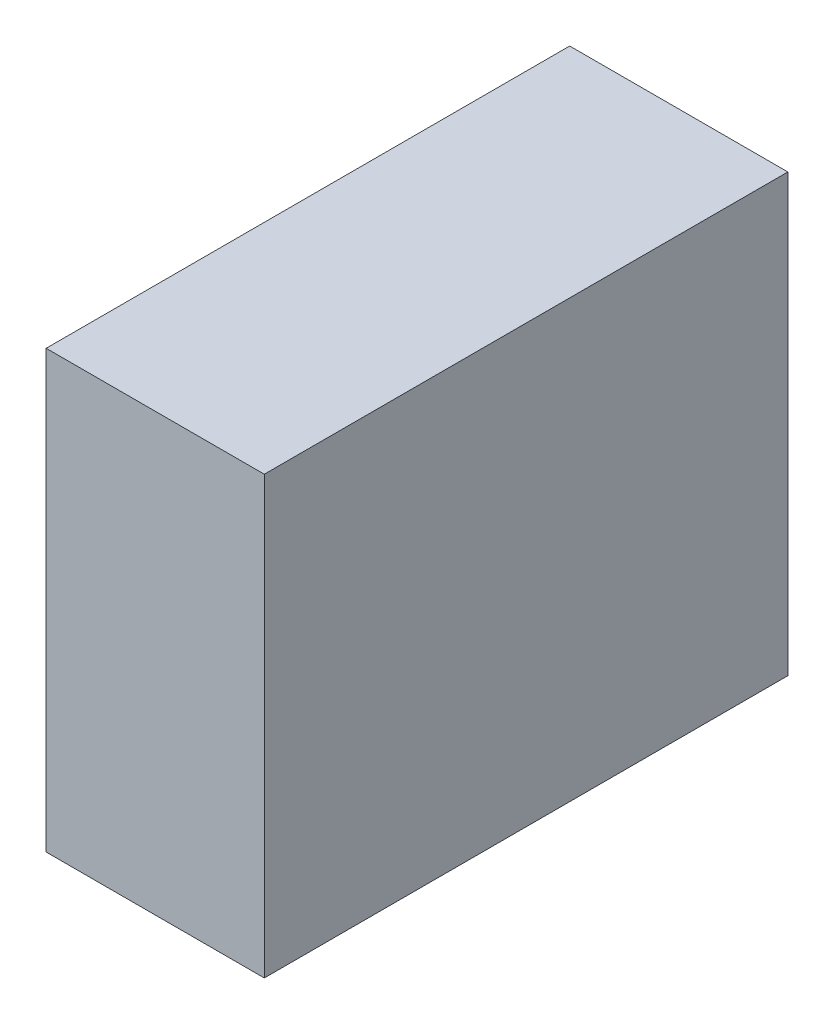
ISO-10303-21;
HEADER;
FILE_DESCRIPTION(('STEP AP214'),'2;1');
FILE_NAME('part.step','',(''),(''),'','','');
FILE_SCHEMA(('AUTOMOTIVE_DESIGN { 1 0 10303 214 1 1 1 1 }'));
ENDSEC;
DATA;
#1=APPLICATION_CONTEXT('core data for automotive mechanical design processes');
#2=APPLICATION_PROTOCOL_DEFINITION('international standard','automotive_design',2000,#1);
#3=PRODUCT_CONTEXT('',#1,'mechanical');
#4=PRODUCT('Part','Part','',(#3));
#5=PRODUCT_RELATED_PRODUCT_CATEGORY('part','',(#4));
#6=PRODUCT_DEFINITION_FORMATION('','',#4);
#7=PRODUCT_DEFINITION_CONTEXT('part definition',#1,'design');
#8=PRODUCT_DEFINITION('design','',#6,#7);
#9=PRODUCT_DEFINITION_SHAPE('','',#8);
#10=(LENGTH_UNIT() NAMED_UNIT(*) SI_UNIT(.MILLI.,.METRE.));
#11=(NAMED_UNIT(*) PLANE_ANGLE_UNIT() SI_UNIT($,.RADIAN.));
#12=(NAMED_UNIT(*) SI_UNIT($,.STERADIAN.) SOLID_ANGLE_UNIT());
#13=UNCERTAINTY_MEASURE_WITH_UNIT(LENGTH_MEASURE(1.E-05),#10,'distance_accuracy_value','');
#14=(GEOMETRIC_REPRESENTATION_CONTEXT(3) GLOBAL_UNCERTAINTY_ASSIGNED_CONTEXT((#13)) GLOBAL_UNIT_ASSIGNED_CONTEXT((#10,
#11,#12)) REPRESENTATION_CONTEXT('',''));
#15=CARTESIAN_POINT('',(0.,0.,0.));
#16=DIRECTION('',(0.,0.,1.));
#17=DIRECTION('',(1.,0.,0.));
#18=AXIS2_PLACEMENT_3D('',#15,#16,#17);
#19=CARTESIAN_POINT('',(370.,200.,-248.));
#20=DIRECTION('',(-1.,0.,0.));
#21=DIRECTION('',(0.,0.,1.));
#22=AXIS2_PLACEMENT_3D('',#19,#20,#21);
#23=PLANE('',#22);
#24=DIRECTION('',(0.,-1.,0.));
#25=VECTOR('',#24,1.);
#26=CARTESIAN_POINT('',(370.,200.,-128.));
#27=LINE('',#26,#25);
#28=CARTESIAN_POINT('',(370.,300.,-128.));
#29=VERTEX_POINT('',#28);
#30=CARTESIAN_POINT('',(370.,200.,-128.));
#31=VERTEX_POINT('',#30);
#32=EDGE_CURVE('E103',#29,#31,#27,.T.);
#33=ORIENTED_EDGE('',*,*,#32,.F.);
#34=DIRECTION('',(0.,0.,1.));
#35=VECTOR('',#34,1.);
#36=CARTESIAN_POINT('',(370.,300.,-248.));
#37=LINE('',#36,#35);
#38=CARTESIAN_POINT('',(370.,300.,-248.));
#39=VERTEX_POINT('',#38);
#40=EDGE_CURVE('E11',#39,#29,#37,.T.);
#41=ORIENTED_EDGE('',*,*,#40,.F.);
#42=DIRECTION('',(0.,-1.,0.));
#43=VECTOR('',#42,1.);
#44=CARTESIAN_POINT('',(370.,200.,-248.));
#45=LINE('',#44,#43);
#46=CARTESIAN_POINT('',(370.,200.,-248.));
#47=VERTEX_POINT('',#46);
#48=EDGE_CURVE('E97',#39,#47,#45,.T.);
#49=ORIENTED_EDGE('',*,*,#48,.T.);
#50=DIRECTION('',(0.,0.,1.));
#51=VECTOR('',#50,1.);
#52=CARTESIAN_POINT('',(370.,200.,-248.));
#53=LINE('',#52,#51);
#54=EDGE_CURVE('E42',#47,#31,#53,.T.);
#55=ORIENTED_EDGE('',*,*,#54,.T.);
#56=EDGE_LOOP('',(#33,#41,#49,#55));
#57=FACE_BOUND('',#56,.T.);
#58=ADVANCED_FACE('F39',(#57),#23,.T.);
#59=CARTESIAN_POINT('',(370.,300.,-248.));
#60=DIRECTION('',(0.,1.,0.));
#61=DIRECTION('',(0.,0.,1.));
#62=AXIS2_PLACEMENT_3D('',#59,#60,#61);
#63=PLANE('',#62);
#64=DIRECTION('',(-1.,0.,0.));
#65=VECTOR('',#64,1.);
#66=CARTESIAN_POINT('',(370.,300.,-128.));
#67=LINE('',#66,#65);
#68=CARTESIAN_POINT('',(420.,300.,-128.));
#69=VERTEX_POINT('',#68);
#70=EDGE_CURVE('E99',#69,#29,#67,.T.);
#71=ORIENTED_EDGE('',*,*,#70,.F.);
#72=DIRECTION('',(0.,0.,1.));
#73=VECTOR('',#72,1.);
#74=CARTESIAN_POINT('',(420.,300.,-248.));
#75=LINE('',#74,#73);
#76=CARTESIAN_POINT('',(420.,300.,-248.));
#77=VERTEX_POINT('',#76);
#78=EDGE_CURVE('E48',#77,#69,#75,.T.);
#79=ORIENTED_EDGE('',*,*,#78,.F.);
#80=DIRECTION('',(-1.,0.,0.));
#81=VECTOR('',#80,1.);
#82=CARTESIAN_POINT('',(370.,300.,-248.));
#83=LINE('',#82,#81);
#84=EDGE_CURVE('E94',#77,#39,#83,.T.);
#85=ORIENTED_EDGE('',*,*,#84,.T.);
#86=ORIENTED_EDGE('',*,*,#40,.T.);
#87=EDGE_LOOP('',(#71,#79,#85,#86));
#88=FACE_BOUND('',#87,.T.);
#89=ADVANCED_FACE('F113',(#88),#63,.T.);
#90=CARTESIAN_POINT('',(420.,200.,-248.));
#91=DIRECTION('',(1.,0.,0.));
#92=DIRECTION('',(0.,0.,-1.));
#93=AXIS2_PLACEMENT_3D('',#90,#91,#92);
#94=PLANE('',#93);
#95=DIRECTION('',(0.,1.,0.));
#96=VECTOR('',#95,1.);
#97=CARTESIAN_POINT('',(420.,200.,-128.));
#98=LINE('',#97,#96);
#99=CARTESIAN_POINT('',(420.,200.,-128.));
#100=VERTEX_POINT('',#99);
#101=EDGE_CURVE('E89',#100,#69,#98,.T.);
#102=ORIENTED_EDGE('',*,*,#101,.F.);
#103=DIRECTION('',(0.,0.,1.));
#104=VECTOR('',#103,1.);
#105=CARTESIAN_POINT('',(420.,200.,-248.));
#106=LINE('',#105,#104);
#107=CARTESIAN_POINT('',(420.,200.,-248.));
#108=VERTEX_POINT('',#107);
#109=EDGE_CURVE('E84',#108,#100,#106,.T.);
#110=ORIENTED_EDGE('',*,*,#109,.F.);
#111=DIRECTION('',(0.,1.,0.));
#112=VECTOR('',#111,1.);
#113=CARTESIAN_POINT('',(420.,200.,-248.));
#114=LINE('',#113,#112);
#115=EDGE_CURVE('E87',#108,#77,#114,.T.);
#116=ORIENTED_EDGE('',*,*,#115,.T.);
#117=ORIENTED_EDGE('',*,*,#78,.T.);
#118=EDGE_LOOP('',(#102,#110,#116,#117));
#119=FACE_BOUND('',#118,.T.);
#120=ADVANCED_FACE('F86',(#119),#94,.T.);
#121=CARTESIAN_POINT('',(370.,200.,-248.));
#122=DIRECTION('',(0.,-1.,0.));
#123=DIRECTION('',(0.,0.,-1.));
#124=AXIS2_PLACEMENT_3D('',#121,#122,#123);
#125=PLANE('',#124);
#126=DIRECTION('',(1.,0.,0.));
#127=VECTOR('',#126,1.);
#128=CARTESIAN_POINT('',(370.,200.,-128.));
#129=LINE('',#128,#127);
#130=EDGE_CURVE('E106',#31,#100,#129,.T.);
#131=ORIENTED_EDGE('',*,*,#130,.F.);
#132=ORIENTED_EDGE('',*,*,#54,.F.);
#133=DIRECTION('',(1.,0.,0.));
#134=VECTOR('',#133,1.);
#135=CARTESIAN_POINT('',(370.,200.,-248.));
#136=LINE('',#135,#134);
#137=EDGE_CURVE('E93',#47,#108,#136,.T.);
#138=ORIENTED_EDGE('',*,*,#137,.T.);
#139=ORIENTED_EDGE('',*,*,#109,.T.);
#140=EDGE_LOOP('',(#131,#132,#138,#139));
#141=FACE_BOUND('',#140,.T.);
#142=ADVANCED_FACE('F96',(#141),#125,.T.);
#143=CARTESIAN_POINT('',(0.,0.,-248.));
#144=DIRECTION('',(0.,0.,-1.));
#145=DIRECTION('',(-1.,0.,0.));
#146=AXIS2_PLACEMENT_3D('',#143,#144,#145);
#147=PLANE('',#146);
#148=ORIENTED_EDGE('',*,*,#48,.F.);
#149=ORIENTED_EDGE('',*,*,#84,.F.);
#150=ORIENTED_EDGE('',*,*,#115,.F.);
#151=ORIENTED_EDGE('',*,*,#137,.F.);
#152=EDGE_LOOP('',(#148,#149,#150,#151));
#153=FACE_BOUND('',#152,.T.);
#154=ADVANCED_FACE('F92',(#153),#147,.T.);
#155=CARTESIAN_POINT('',(0.,0.,-128.));
#156=DIRECTION('',(0.,0.,-1.));
#157=DIRECTION('',(-1.,0.,0.));
#158=AXIS2_PLACEMENT_3D('',#155,#156,#157);
#159=PLANE('',#158);
#160=ORIENTED_EDGE('',*,*,#32,.T.);
#161=ORIENTED_EDGE('',*,*,#130,.T.);
#162=ORIENTED_EDGE('',*,*,#101,.T.);
#163=ORIENTED_EDGE('',*,*,#70,.T.);
#164=EDGE_LOOP('',(#160,#161,#162,#163));
#165=FACE_BOUND('',#164,.T.);
#166=ADVANCED_FACE('F112',(#165),#159,.F.);
#167=CLOSED_SHELL('',(#58,#89,#120,#142,#154,#166));
#168=MANIFOLD_SOLID_BREP('B2',#167);
#169=ADVANCED_BREP_SHAPE_REPRESENTATION('',(#18,#168),#14);
#170=SHAPE_DEFINITION_REPRESENTATION(#9,#169);
ENDSEC;
END-ISO-10303-21;
